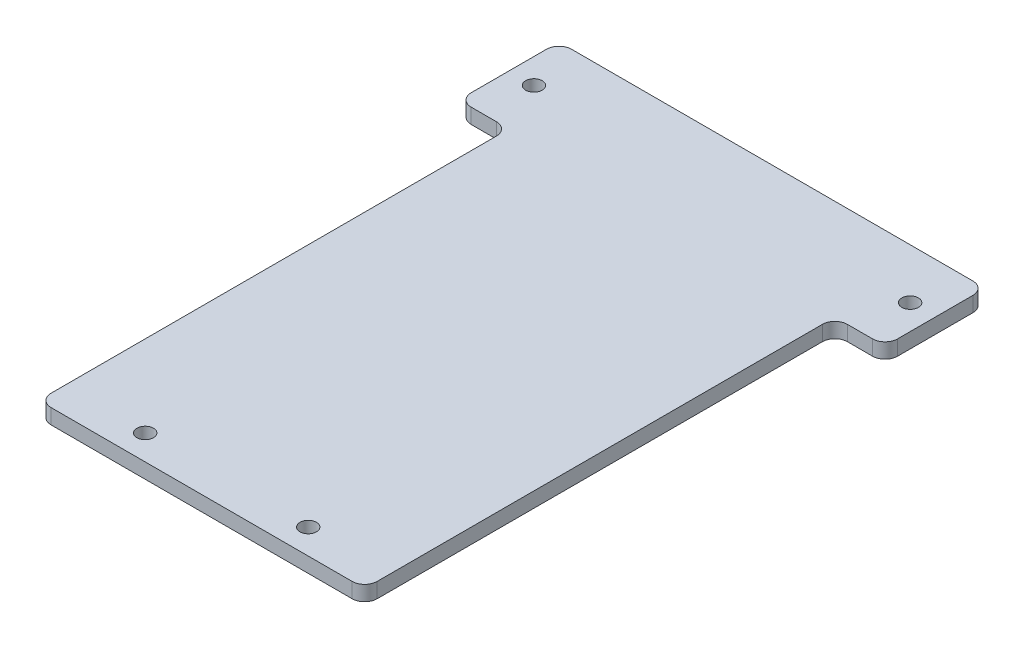
ISO-10303-21;
HEADER;
FILE_DESCRIPTION(('STEP AP214'),'2;1');
FILE_NAME('part.step','',(''),(''),'','','');
FILE_SCHEMA(('AUTOMOTIVE_DESIGN { 1 0 10303 214 1 1 1 1 }'));
ENDSEC;
DATA;
#1=APPLICATION_CONTEXT('core data for automotive mechanical design processes');
#2=APPLICATION_PROTOCOL_DEFINITION('international standard','automotive_design',2000,#1);
#3=PRODUCT_CONTEXT('',#1,'mechanical');
#4=PRODUCT('Part','Part','',(#3));
#5=PRODUCT_RELATED_PRODUCT_CATEGORY('part','',(#4));
#6=PRODUCT_DEFINITION_FORMATION('','',#4);
#7=PRODUCT_DEFINITION_CONTEXT('part definition',#1,'design');
#8=PRODUCT_DEFINITION('design','',#6,#7);
#9=PRODUCT_DEFINITION_SHAPE('','',#8);
#10=(LENGTH_UNIT() NAMED_UNIT(*) SI_UNIT(.MILLI.,.METRE.));
#11=(NAMED_UNIT(*) PLANE_ANGLE_UNIT() SI_UNIT($,.RADIAN.));
#12=(NAMED_UNIT(*) SI_UNIT($,.STERADIAN.) SOLID_ANGLE_UNIT());
#13=UNCERTAINTY_MEASURE_WITH_UNIT(LENGTH_MEASURE(1.E-05),#10,'distance_accuracy_value','');
#14=(GEOMETRIC_REPRESENTATION_CONTEXT(3) GLOBAL_UNCERTAINTY_ASSIGNED_CONTEXT((#13)) GLOBAL_UNIT_ASSIGNED_CONTEXT((#10,
#11,#12)) REPRESENTATION_CONTEXT('',''));
#15=CARTESIAN_POINT('',(0.,0.,0.));
#16=DIRECTION('',(0.,0.,1.));
#17=DIRECTION('',(1.,0.,0.));
#18=AXIS2_PLACEMENT_3D('',#15,#16,#17);
#19=CARTESIAN_POINT('',(65.,6.,-93.75));
#20=DIRECTION('',(0.,0.,-1.));
#21=DIRECTION('',(-1.,0.,0.));
#22=AXIS2_PLACEMENT_3D('',#19,#20,#21);
#23=PLANE('',#22);
#24=DIRECTION('',(1.,0.,0.));
#25=VECTOR('',#24,1.);
#26=CARTESIAN_POINT('',(65.,0.,-93.75));
#27=LINE('',#26,#25);
#28=CARTESIAN_POINT('',(70.,0.,-93.75));
#29=VERTEX_POINT('',#28);
#30=CARTESIAN_POINT('',(80.,0.,-93.75));
#31=VERTEX_POINT('',#30);
#32=EDGE_CURVE('E251',#29,#31,#27,.T.);
#33=ORIENTED_EDGE('',*,*,#32,.T.);
#34=DIRECTION('',(0.,-1.,0.));
#35=VECTOR('',#34,1.);
#36=CARTESIAN_POINT('',(80.,6.,-93.75));
#37=LINE('',#36,#35);
#38=CARTESIAN_POINT('',(80.,6.,-93.75));
#39=VERTEX_POINT('',#38);
#40=EDGE_CURVE('E238',#31,#39,#37,.F.);
#41=ORIENTED_EDGE('',*,*,#40,.T.);
#42=DIRECTION('',(1.,0.,0.));
#43=VECTOR('',#42,1.);
#44=CARTESIAN_POINT('',(65.,6.,-93.75));
#45=LINE('',#44,#43);
#46=CARTESIAN_POINT('',(70.,6.,-93.75));
#47=VERTEX_POINT('',#46);
#48=EDGE_CURVE('E192',#47,#39,#45,.T.);
#49=ORIENTED_EDGE('',*,*,#48,.F.);
#50=DIRECTION('',(0.,-1.,0.));
#51=VECTOR('',#50,1.);
#52=CARTESIAN_POINT('',(70.,0.,-93.75));
#53=LINE('',#52,#51);
#54=EDGE_CURVE('E235',#47,#29,#53,.T.);
#55=ORIENTED_EDGE('',*,*,#54,.T.);
#56=EDGE_LOOP('',(#33,#41,#49,#55));
#57=FACE_BOUND('',#56,.T.);
#58=ADVANCED_FACE('F39',(#57),#23,.F.);
#59=CARTESIAN_POINT('',(85.,6.,-133.75));
#60=DIRECTION('',(-1.,0.,0.));
#61=DIRECTION('',(0.,0.,1.));
#62=AXIS2_PLACEMENT_3D('',#59,#60,#61);
#63=PLANE('',#62);
#64=DIRECTION('',(0.,0.,-1.));
#65=VECTOR('',#64,1.);
#66=CARTESIAN_POINT('',(85.,0.,-133.75));
#67=LINE('',#66,#65);
#68=CARTESIAN_POINT('',(85.,0.,-98.75));
#69=VERTEX_POINT('',#68);
#70=CARTESIAN_POINT('',(85.,0.,-128.75));
#71=VERTEX_POINT('',#70);
#72=EDGE_CURVE('E286',#69,#71,#67,.T.);
#73=ORIENTED_EDGE('',*,*,#72,.T.);
#74=DIRECTION('',(0.,-1.,0.));
#75=VECTOR('',#74,1.);
#76=CARTESIAN_POINT('',(85.,6.,-128.75));
#77=LINE('',#76,#75);
#78=CARTESIAN_POINT('',(85.,6.,-128.75));
#79=VERTEX_POINT('',#78);
#80=EDGE_CURVE('E233',#71,#79,#77,.F.);
#81=ORIENTED_EDGE('',*,*,#80,.T.);
#82=DIRECTION('',(0.,0.,-1.));
#83=VECTOR('',#82,1.);
#84=CARTESIAN_POINT('',(85.,6.,-133.75));
#85=LINE('',#84,#83);
#86=CARTESIAN_POINT('',(85.,6.,-98.75));
#87=VERTEX_POINT('',#86);
#88=EDGE_CURVE('E265',#87,#79,#85,.T.);
#89=ORIENTED_EDGE('',*,*,#88,.F.);
#90=DIRECTION('',(0.,-1.,0.));
#91=VECTOR('',#90,1.);
#92=CARTESIAN_POINT('',(85.,6.,-98.75));
#93=LINE('',#92,#91);
#94=EDGE_CURVE('E230',#87,#69,#93,.T.);
#95=ORIENTED_EDGE('',*,*,#94,.T.);
#96=EDGE_LOOP('',(#73,#81,#89,#95));
#97=FACE_BOUND('',#96,.T.);
#98=ADVANCED_FACE('F316',(#97),#63,.F.);
#99=CARTESIAN_POINT('',(-85.,6.,-133.75));
#100=DIRECTION('',(0.,0.,1.));
#101=DIRECTION('',(1.,0.,0.));
#102=AXIS2_PLACEMENT_3D('',#99,#100,#101);
#103=PLANE('',#102);
#104=DIRECTION('',(-1.,0.,0.));
#105=VECTOR('',#104,1.);
#106=CARTESIAN_POINT('',(-85.,0.,-133.75));
#107=LINE('',#106,#105);
#108=CARTESIAN_POINT('',(80.,0.,-133.75));
#109=VERTEX_POINT('',#108);
#110=CARTESIAN_POINT('',(-80.,0.,-133.75));
#111=VERTEX_POINT('',#110);
#112=EDGE_CURVE('E290',#109,#111,#107,.T.);
#113=ORIENTED_EDGE('',*,*,#112,.T.);
#114=DIRECTION('',(0.,-1.,0.));
#115=VECTOR('',#114,1.);
#116=CARTESIAN_POINT('',(-80.,6.,-133.75));
#117=LINE('',#116,#115);
#118=CARTESIAN_POINT('',(-80.,6.,-133.75));
#119=VERTEX_POINT('',#118);
#120=EDGE_CURVE('E217',#111,#119,#117,.F.);
#121=ORIENTED_EDGE('',*,*,#120,.T.);
#122=DIRECTION('',(-1.,0.,0.));
#123=VECTOR('',#122,1.);
#124=CARTESIAN_POINT('',(-85.,6.,-133.75));
#125=LINE('',#124,#123);
#126=CARTESIAN_POINT('',(80.,6.,-133.75));
#127=VERTEX_POINT('',#126);
#128=EDGE_CURVE('E268',#127,#119,#125,.T.);
#129=ORIENTED_EDGE('',*,*,#128,.F.);
#130=DIRECTION('',(0.,-1.,0.));
#131=VECTOR('',#130,1.);
#132=CARTESIAN_POINT('',(80.,6.,-133.75));
#133=LINE('',#132,#131);
#134=EDGE_CURVE('E214',#127,#109,#133,.T.);
#135=ORIENTED_EDGE('',*,*,#134,.T.);
#136=EDGE_LOOP('',(#113,#121,#129,#135));
#137=FACE_BOUND('',#136,.T.);
#138=ADVANCED_FACE('F313',(#137),#103,.F.);
#139=CARTESIAN_POINT('',(-85.,6.,-133.75));
#140=DIRECTION('',(1.,0.,0.));
#141=DIRECTION('',(0.,0.,-1.));
#142=AXIS2_PLACEMENT_3D('',#139,#140,#141);
#143=PLANE('',#142);
#144=DIRECTION('',(0.,0.,1.));
#145=VECTOR('',#144,1.);
#146=CARTESIAN_POINT('',(-85.,6.,-133.75));
#147=LINE('',#146,#145);
#148=CARTESIAN_POINT('',(-85.,6.,-128.75));
#149=VERTEX_POINT('',#148);
#150=CARTESIAN_POINT('',(-85.,6.,-98.75));
#151=VERTEX_POINT('',#150);
#152=EDGE_CURVE('E275',#149,#151,#147,.T.);
#153=ORIENTED_EDGE('',*,*,#152,.F.);
#154=DIRECTION('',(0.,-1.,0.));
#155=VECTOR('',#154,1.);
#156=CARTESIAN_POINT('',(-85.,6.,-128.75));
#157=LINE('',#156,#155);
#158=CARTESIAN_POINT('',(-85.,0.,-128.75));
#159=VERTEX_POINT('',#158);
#160=EDGE_CURVE('E200',#149,#159,#157,.T.);
#161=ORIENTED_EDGE('',*,*,#160,.T.);
#162=DIRECTION('',(0.,0.,1.));
#163=VECTOR('',#162,1.);
#164=CARTESIAN_POINT('',(-85.,0.,-133.75));
#165=LINE('',#164,#163);
#166=CARTESIAN_POINT('',(-85.,0.,-98.75));
#167=VERTEX_POINT('',#166);
#168=EDGE_CURVE('E187',#159,#167,#165,.T.);
#169=ORIENTED_EDGE('',*,*,#168,.T.);
#170=DIRECTION('',(0.,-1.,0.));
#171=VECTOR('',#170,1.);
#172=CARTESIAN_POINT('',(-85.,6.,-98.75));
#173=LINE('',#172,#171);
#174=EDGE_CURVE('E198',#167,#151,#173,.F.);
#175=ORIENTED_EDGE('',*,*,#174,.T.);
#176=EDGE_LOOP('',(#153,#161,#169,#175));
#177=FACE_BOUND('',#176,.T.);
#178=ADVANCED_FACE('F296',(#177),#143,.F.);
#179=CARTESIAN_POINT('',(-85.,6.,-93.75));
#180=DIRECTION('',(0.,0.,-1.));
#181=DIRECTION('',(-1.,0.,0.));
#182=AXIS2_PLACEMENT_3D('',#179,#180,#181);
#183=PLANE('',#182);
#184=DIRECTION('',(1.,0.,0.));
#185=VECTOR('',#184,1.);
#186=CARTESIAN_POINT('',(-85.,0.,-93.75));
#187=LINE('',#186,#185);
#188=CARTESIAN_POINT('',(-80.,0.,-93.75));
#189=VERTEX_POINT('',#188);
#190=CARTESIAN_POINT('',(-70.,0.,-93.75));
#191=VERTEX_POINT('',#190);
#192=EDGE_CURVE('E182',#189,#191,#187,.T.);
#193=ORIENTED_EDGE('',*,*,#192,.T.);
#194=DIRECTION('',(0.,-1.,0.));
#195=VECTOR('',#194,1.);
#196=CARTESIAN_POINT('',(-70.,6.,-93.75));
#197=LINE('',#196,#195);
#198=CARTESIAN_POINT('',(-70.,6.,-93.75));
#199=VERTEX_POINT('',#198);
#200=EDGE_CURVE('E158',#191,#199,#197,.F.);
#201=ORIENTED_EDGE('',*,*,#200,.T.);
#202=DIRECTION('',(1.,0.,0.));
#203=VECTOR('',#202,1.);
#204=CARTESIAN_POINT('',(-85.,6.,-93.75));
#205=LINE('',#204,#203);
#206=CARTESIAN_POINT('',(-80.,6.,-93.75));
#207=VERTEX_POINT('',#206);
#208=EDGE_CURVE('E278',#207,#199,#205,.T.);
#209=ORIENTED_EDGE('',*,*,#208,.F.);
#210=DIRECTION('',(0.,-1.,0.));
#211=VECTOR('',#210,1.);
#212=CARTESIAN_POINT('',(-80.,6.,-93.75));
#213=LINE('',#212,#211);
#214=EDGE_CURVE('E174',#207,#189,#213,.T.);
#215=ORIENTED_EDGE('',*,*,#214,.T.);
#216=EDGE_LOOP('',(#193,#201,#209,#215));
#217=FACE_BOUND('',#216,.T.);
#218=ADVANCED_FACE('F304',(#217),#183,.F.);
#219=CARTESIAN_POINT('',(-65.,6.,93.75));
#220=DIRECTION('',(1.,0.,0.));
#221=DIRECTION('',(0.,0.,-1.));
#222=AXIS2_PLACEMENT_3D('',#219,#220,#221);
#223=PLANE('',#222);
#224=DIRECTION('',(0.,0.,1.));
#225=VECTOR('',#224,1.);
#226=CARTESIAN_POINT('',(-65.,6.,93.75));
#227=LINE('',#226,#225);
#228=CARTESIAN_POINT('',(-65.,6.,-88.75));
#229=VERTEX_POINT('',#228);
#230=CARTESIAN_POINT('',(-65.,6.,88.75));
#231=VERTEX_POINT('',#230);
#232=EDGE_CURVE('E173',#229,#231,#227,.T.);
#233=ORIENTED_EDGE('',*,*,#232,.F.);
#234=DIRECTION('',(0.,-1.,0.));
#235=VECTOR('',#234,1.);
#236=CARTESIAN_POINT('',(-65.,0.,-88.75));
#237=LINE('',#236,#235);
#238=CARTESIAN_POINT('',(-65.,0.,-88.75));
#239=VERTEX_POINT('',#238);
#240=EDGE_CURVE('E157',#229,#239,#237,.T.);
#241=ORIENTED_EDGE('',*,*,#240,.T.);
#242=DIRECTION('',(0.,0.,1.));
#243=VECTOR('',#242,1.);
#244=CARTESIAN_POINT('',(-65.,0.,93.75));
#245=LINE('',#244,#243);
#246=CARTESIAN_POINT('',(-65.,0.,88.75));
#247=VERTEX_POINT('',#246);
#248=EDGE_CURVE('E170',#239,#247,#245,.T.);
#249=ORIENTED_EDGE('',*,*,#248,.T.);
#250=DIRECTION('',(0.,-1.,0.));
#251=VECTOR('',#250,1.);
#252=CARTESIAN_POINT('',(-65.,6.,88.75));
#253=LINE('',#252,#251);
#254=EDGE_CURVE('E175',#247,#231,#253,.F.);
#255=ORIENTED_EDGE('',*,*,#254,.T.);
#256=EDGE_LOOP('',(#233,#241,#249,#255));
#257=FACE_BOUND('',#256,.T.);
#258=ADVANCED_FACE('F169',(#257),#223,.F.);
#259=CARTESIAN_POINT('',(-65.,6.,93.75));
#260=DIRECTION('',(0.,0.,-1.));
#261=DIRECTION('',(-1.,0.,0.));
#262=AXIS2_PLACEMENT_3D('',#259,#260,#261);
#263=PLANE('',#262);
#264=DIRECTION('',(1.,0.,0.));
#265=VECTOR('',#264,1.);
#266=CARTESIAN_POINT('',(-65.,0.,93.75));
#267=LINE('',#266,#265);
#268=CARTESIAN_POINT('',(-60.,0.,93.75));
#269=VERTEX_POINT('',#268);
#270=CARTESIAN_POINT('',(60.,0.,93.75));
#271=VERTEX_POINT('',#270);
#272=EDGE_CURVE('E181',#269,#271,#267,.T.);
#273=ORIENTED_EDGE('',*,*,#272,.T.);
#274=DIRECTION('',(0.,-1.,0.));
#275=VECTOR('',#274,1.);
#276=CARTESIAN_POINT('',(60.,6.,93.75));
#277=LINE('',#276,#275);
#278=CARTESIAN_POINT('',(60.,6.,93.75));
#279=VERTEX_POINT('',#278);
#280=EDGE_CURVE('E164',#271,#279,#277,.F.);
#281=ORIENTED_EDGE('',*,*,#280,.T.);
#282=DIRECTION('',(1.,0.,0.));
#283=VECTOR('',#282,1.);
#284=CARTESIAN_POINT('',(-65.,6.,93.75));
#285=LINE('',#284,#283);
#286=CARTESIAN_POINT('',(-60.,6.,93.75));
#287=VERTEX_POINT('',#286);
#288=EDGE_CURVE('E282',#287,#279,#285,.T.);
#289=ORIENTED_EDGE('',*,*,#288,.F.);
#290=DIRECTION('',(0.,-1.,0.));
#291=VECTOR('',#290,1.);
#292=CARTESIAN_POINT('',(-60.,6.,93.75));
#293=LINE('',#292,#291);
#294=EDGE_CURVE('E244',#287,#269,#293,.T.);
#295=ORIENTED_EDGE('',*,*,#294,.T.);
#296=EDGE_LOOP('',(#273,#281,#289,#295));
#297=FACE_BOUND('',#296,.T.);
#298=ADVANCED_FACE('F311',(#297),#263,.F.);
#299=CARTESIAN_POINT('',(65.,6.,93.75));
#300=DIRECTION('',(-1.,0.,0.));
#301=DIRECTION('',(0.,0.,1.));
#302=AXIS2_PLACEMENT_3D('',#299,#300,#301);
#303=PLANE('',#302);
#304=DIRECTION('',(0.,0.,-1.));
#305=VECTOR('',#304,1.);
#306=CARTESIAN_POINT('',(65.,0.,93.75));
#307=LINE('',#306,#305);
#308=CARTESIAN_POINT('',(65.,0.,88.75));
#309=VERTEX_POINT('',#308);
#310=CARTESIAN_POINT('',(65.,0.,-88.75));
#311=VERTEX_POINT('',#310);
#312=EDGE_CURVE('E185',#309,#311,#307,.T.);
#313=ORIENTED_EDGE('',*,*,#312,.T.);
#314=DIRECTION('',(0.,-1.,0.));
#315=VECTOR('',#314,1.);
#316=CARTESIAN_POINT('',(65.,6.,-88.75));
#317=LINE('',#316,#315);
#318=CARTESIAN_POINT('',(65.,6.,-88.75));
#319=VERTEX_POINT('',#318);
#320=EDGE_CURVE('E54',#311,#319,#317,.F.);
#321=ORIENTED_EDGE('',*,*,#320,.T.);
#322=DIRECTION('',(0.,0.,-1.));
#323=VECTOR('',#322,1.);
#324=CARTESIAN_POINT('',(65.,6.,93.75));
#325=LINE('',#324,#323);
#326=CARTESIAN_POINT('',(65.,6.,88.75));
#327=VERTEX_POINT('',#326);
#328=EDGE_CURVE('E193',#327,#319,#325,.T.);
#329=ORIENTED_EDGE('',*,*,#328,.F.);
#330=DIRECTION('',(0.,-1.,0.));
#331=VECTOR('',#330,1.);
#332=CARTESIAN_POINT('',(65.,6.,88.75));
#333=LINE('',#332,#331);
#334=EDGE_CURVE('E240',#327,#309,#333,.T.);
#335=ORIENTED_EDGE('',*,*,#334,.T.);
#336=EDGE_LOOP('',(#313,#321,#329,#335));
#337=FACE_BOUND('',#336,.T.);
#338=ADVANCED_FACE('F254',(#337),#303,.F.);
#339=CARTESIAN_POINT('',(0.,6.,0.));
#340=DIRECTION('',(0.,-1.,0.));
#341=DIRECTION('',(0.,0.,-1.));
#342=AXIS2_PLACEMENT_3D('',#339,#340,#341);
#343=PLANE('',#342);
#344=CARTESIAN_POINT('',(-75.,6.,-113.75));
#345=DIRECTION('',(0.,1.,0.));
#346=DIRECTION('',(0.,0.,1.));
#347=AXIS2_PLACEMENT_3D('',#344,#345,#346);
#348=CIRCLE('',#347,3.3);
#349=CARTESIAN_POINT('',(-75.,6.,-110.45));
#350=VERTEX_POINT('',#349);
#351=EDGE_CURVE('E389',#350,#350,#348,.T.);
#352=ORIENTED_EDGE('',*,*,#351,.F.);
#353=EDGE_LOOP('',(#352));
#354=FACE_BOUND('',#353,.T.);
#355=CARTESIAN_POINT('',(32.5,6.,83.75));
#356=DIRECTION('',(0.,1.,0.));
#357=DIRECTION('',(0.,0.,-1.));
#358=AXIS2_PLACEMENT_3D('',#355,#356,#357);
#359=CIRCLE('',#358,3.3);
#360=CARTESIAN_POINT('',(32.5,6.,80.45));
#361=VERTEX_POINT('',#360);
#362=EDGE_CURVE('E397',#361,#361,#359,.T.);
#363=ORIENTED_EDGE('',*,*,#362,.F.);
#364=EDGE_LOOP('',(#363));
#365=FACE_BOUND('',#364,.T.);
#366=CARTESIAN_POINT('',(75.,6.,-113.75));
#367=DIRECTION('',(0.,1.,0.));
#368=DIRECTION('',(0.,0.,-1.));
#369=AXIS2_PLACEMENT_3D('',#366,#367,#368);
#370=CIRCLE('',#369,3.3);
#371=CARTESIAN_POINT('',(75.,6.,-117.05));
#372=VERTEX_POINT('',#371);
#373=EDGE_CURVE('E404',#372,#372,#370,.T.);
#374=ORIENTED_EDGE('',*,*,#373,.F.);
#375=EDGE_LOOP('',(#374));
#376=FACE_BOUND('',#375,.T.);
#377=CARTESIAN_POINT('',(-32.5,6.,83.75));
#378=DIRECTION('',(0.,1.,0.));
#379=DIRECTION('',(0.,0.,1.));
#380=AXIS2_PLACEMENT_3D('',#377,#378,#379);
#381=CIRCLE('',#380,3.3);
#382=CARTESIAN_POINT('',(-32.5,6.,87.05));
#383=VERTEX_POINT('',#382);
#384=EDGE_CURVE('E390',#383,#383,#381,.T.);
#385=ORIENTED_EDGE('',*,*,#384,.F.);
#386=EDGE_LOOP('',(#385));
#387=FACE_BOUND('',#386,.T.);
#388=ORIENTED_EDGE('',*,*,#128,.T.);
#389=CARTESIAN_POINT('',(-80.,6.,-128.75));
#390=DIRECTION('',(0.,-1.,0.));
#391=DIRECTION('',(0.,0.,-1.));
#392=AXIS2_PLACEMENT_3D('',#389,#390,#391);
#393=CIRCLE('',#392,5.);
#394=EDGE_CURVE('E228',#119,#149,#393,.F.);
#395=ORIENTED_EDGE('',*,*,#394,.T.);
#396=ORIENTED_EDGE('',*,*,#152,.T.);
#397=CARTESIAN_POINT('',(-80.,6.,-98.75));
#398=DIRECTION('',(0.,-1.,0.));
#399=DIRECTION('',(0.,0.,-1.));
#400=AXIS2_PLACEMENT_3D('',#397,#398,#399);
#401=CIRCLE('',#400,5.);
#402=EDGE_CURVE('E226',#151,#207,#401,.F.);
#403=ORIENTED_EDGE('',*,*,#402,.T.);
#404=ORIENTED_EDGE('',*,*,#208,.T.);
#405=CARTESIAN_POINT('',(-70.,6.,-88.75));
#406=DIRECTION('',(0.,-1.,0.));
#407=DIRECTION('',(0.,0.,-1.));
#408=AXIS2_PLACEMENT_3D('',#405,#406,#407);
#409=CIRCLE('',#408,5.);
#410=EDGE_CURVE('E163',#199,#229,#409,.T.);
#411=ORIENTED_EDGE('',*,*,#410,.T.);
#412=ORIENTED_EDGE('',*,*,#232,.T.);
#413=CARTESIAN_POINT('',(-60.,6.,88.75));
#414=DIRECTION('',(0.,-1.,0.));
#415=DIRECTION('',(0.,0.,-1.));
#416=AXIS2_PLACEMENT_3D('',#413,#414,#415);
#417=CIRCLE('',#416,5.);
#418=EDGE_CURVE('E219',#231,#287,#417,.F.);
#419=ORIENTED_EDGE('',*,*,#418,.T.);
#420=ORIENTED_EDGE('',*,*,#288,.T.);
#421=CARTESIAN_POINT('',(60.,6.,88.75));
#422=DIRECTION('',(0.,-1.,0.));
#423=DIRECTION('',(0.,0.,-1.));
#424=AXIS2_PLACEMENT_3D('',#421,#422,#423);
#425=CIRCLE('',#424,5.);
#426=EDGE_CURVE('E61',#279,#327,#425,.F.);
#427=ORIENTED_EDGE('',*,*,#426,.T.);
#428=ORIENTED_EDGE('',*,*,#328,.T.);
#429=CARTESIAN_POINT('',(70.,6.,-88.75));
#430=DIRECTION('',(0.,-1.,0.));
#431=DIRECTION('',(0.,0.,-1.));
#432=AXIS2_PLACEMENT_3D('',#429,#430,#431);
#433=CIRCLE('',#432,5.);
#434=EDGE_CURVE('E11',#319,#47,#433,.T.);
#435=ORIENTED_EDGE('',*,*,#434,.T.);
#436=ORIENTED_EDGE('',*,*,#48,.T.);
#437=CARTESIAN_POINT('',(80.,6.,-98.75));
#438=DIRECTION('',(0.,-1.,0.));
#439=DIRECTION('',(0.,0.,-1.));
#440=AXIS2_PLACEMENT_3D('',#437,#438,#439);
#441=CIRCLE('',#440,5.);
#442=EDGE_CURVE('E222',#39,#87,#441,.F.);
#443=ORIENTED_EDGE('',*,*,#442,.T.);
#444=ORIENTED_EDGE('',*,*,#88,.T.);
#445=CARTESIAN_POINT('',(80.,6.,-128.75));
#446=DIRECTION('',(0.,-1.,0.));
#447=DIRECTION('',(0.,0.,-1.));
#448=AXIS2_PLACEMENT_3D('',#445,#446,#447);
#449=CIRCLE('',#448,5.);
#450=EDGE_CURVE('E224',#79,#127,#449,.F.);
#451=ORIENTED_EDGE('',*,*,#450,.T.);
#452=EDGE_LOOP('',(#388,#395,#396,#403,#404,#411,#412,#419,#420,#427,#428,#435,#436,#443,#444,#451));
#453=FACE_BOUND('',#452,.T.);
#454=ADVANCED_FACE('F261',(#354,#365,#376,#387,#453),#343,.F.);
#455=CARTESIAN_POINT('',(0.,0.,0.));
#456=DIRECTION('',(0.,-1.,0.));
#457=DIRECTION('',(0.,0.,-1.));
#458=AXIS2_PLACEMENT_3D('',#455,#456,#457);
#459=PLANE('',#458);
#460=CARTESIAN_POINT('',(-75.,0.,-113.75));
#461=DIRECTION('',(0.,1.,0.));
#462=DIRECTION('',(0.,0.,1.));
#463=AXIS2_PLACEMENT_3D('',#460,#461,#462);
#464=CIRCLE('',#463,3.3);
#465=CARTESIAN_POINT('',(-75.,0.,-110.45));
#466=VERTEX_POINT('',#465);
#467=EDGE_CURVE('E287',#466,#466,#464,.T.);
#468=ORIENTED_EDGE('',*,*,#467,.T.);
#469=EDGE_LOOP('',(#468));
#470=FACE_BOUND('',#469,.T.);
#471=CARTESIAN_POINT('',(32.5,0.,83.75));
#472=DIRECTION('',(0.,1.,0.));
#473=DIRECTION('',(0.,0.,-1.));
#474=AXIS2_PLACEMENT_3D('',#471,#472,#473);
#475=CIRCLE('',#474,3.3);
#476=CARTESIAN_POINT('',(32.5,0.,80.45));
#477=VERTEX_POINT('',#476);
#478=EDGE_CURVE('E400',#477,#477,#475,.T.);
#479=ORIENTED_EDGE('',*,*,#478,.T.);
#480=EDGE_LOOP('',(#479));
#481=FACE_BOUND('',#480,.T.);
#482=CARTESIAN_POINT('',(75.,0.,-113.75));
#483=DIRECTION('',(0.,1.,0.));
#484=DIRECTION('',(0.,0.,-1.));
#485=AXIS2_PLACEMENT_3D('',#482,#483,#484);
#486=CIRCLE('',#485,3.3);
#487=CARTESIAN_POINT('',(75.,0.,-117.05));
#488=VERTEX_POINT('',#487);
#489=EDGE_CURVE('E271',#488,#488,#486,.T.);
#490=ORIENTED_EDGE('',*,*,#489,.T.);
#491=EDGE_LOOP('',(#490));
#492=FACE_BOUND('',#491,.T.);
#493=CARTESIAN_POINT('',(-32.5,0.,83.75));
#494=DIRECTION('',(0.,1.,0.));
#495=DIRECTION('',(0.,0.,1.));
#496=AXIS2_PLACEMENT_3D('',#493,#494,#495);
#497=CIRCLE('',#496,3.3);
#498=CARTESIAN_POINT('',(-32.5,0.,87.05));
#499=VERTEX_POINT('',#498);
#500=EDGE_CURVE('E394',#499,#499,#497,.T.);
#501=ORIENTED_EDGE('',*,*,#500,.T.);
#502=EDGE_LOOP('',(#501));
#503=FACE_BOUND('',#502,.T.);
#504=ORIENTED_EDGE('',*,*,#168,.F.);
#505=CARTESIAN_POINT('',(-80.,0.,-128.75));
#506=DIRECTION('',(0.,-1.,0.));
#507=DIRECTION('',(0.,0.,-1.));
#508=AXIS2_PLACEMENT_3D('',#505,#506,#507);
#509=CIRCLE('',#508,5.);
#510=EDGE_CURVE('E212',#159,#111,#509,.T.);
#511=ORIENTED_EDGE('',*,*,#510,.T.);
#512=ORIENTED_EDGE('',*,*,#112,.F.);
#513=CARTESIAN_POINT('',(80.,0.,-128.75));
#514=DIRECTION('',(0.,-1.,0.));
#515=DIRECTION('',(0.,0.,-1.));
#516=AXIS2_PLACEMENT_3D('',#513,#514,#515);
#517=CIRCLE('',#516,5.);
#518=EDGE_CURVE('E208',#109,#71,#517,.T.);
#519=ORIENTED_EDGE('',*,*,#518,.T.);
#520=ORIENTED_EDGE('',*,*,#72,.F.);
#521=CARTESIAN_POINT('',(80.,0.,-98.75));
#522=DIRECTION('',(0.,-1.,0.));
#523=DIRECTION('',(0.,0.,-1.));
#524=AXIS2_PLACEMENT_3D('',#521,#522,#523);
#525=CIRCLE('',#524,5.);
#526=EDGE_CURVE('E206',#69,#31,#525,.T.);
#527=ORIENTED_EDGE('',*,*,#526,.T.);
#528=ORIENTED_EDGE('',*,*,#32,.F.);
#529=CARTESIAN_POINT('',(70.,0.,-88.75));
#530=DIRECTION('',(0.,-1.,0.));
#531=DIRECTION('',(0.,0.,-1.));
#532=AXIS2_PLACEMENT_3D('',#529,#530,#531);
#533=CIRCLE('',#532,5.);
#534=EDGE_CURVE('E47',#29,#311,#533,.F.);
#535=ORIENTED_EDGE('',*,*,#534,.T.);
#536=ORIENTED_EDGE('',*,*,#312,.F.);
#537=CARTESIAN_POINT('',(60.,0.,88.75));
#538=DIRECTION('',(0.,-1.,0.));
#539=DIRECTION('',(0.,0.,-1.));
#540=AXIS2_PLACEMENT_3D('',#537,#538,#539);
#541=CIRCLE('',#540,5.);
#542=EDGE_CURVE('E204',#309,#271,#541,.T.);
#543=ORIENTED_EDGE('',*,*,#542,.T.);
#544=ORIENTED_EDGE('',*,*,#272,.F.);
#545=CARTESIAN_POINT('',(-60.,0.,88.75));
#546=DIRECTION('',(0.,-1.,0.));
#547=DIRECTION('',(0.,0.,-1.));
#548=AXIS2_PLACEMENT_3D('',#545,#546,#547);
#549=CIRCLE('',#548,5.);
#550=EDGE_CURVE('E180',#269,#247,#549,.T.);
#551=ORIENTED_EDGE('',*,*,#550,.T.);
#552=ORIENTED_EDGE('',*,*,#248,.F.);
#553=CARTESIAN_POINT('',(-70.,0.,-88.75));
#554=DIRECTION('',(0.,-1.,0.));
#555=DIRECTION('',(0.,0.,-1.));
#556=AXIS2_PLACEMENT_3D('',#553,#554,#555);
#557=CIRCLE('',#556,5.);
#558=EDGE_CURVE('E153',#239,#191,#557,.F.);
#559=ORIENTED_EDGE('',*,*,#558,.T.);
#560=ORIENTED_EDGE('',*,*,#192,.F.);
#561=CARTESIAN_POINT('',(-80.,0.,-98.75));
#562=DIRECTION('',(0.,-1.,0.));
#563=DIRECTION('',(0.,0.,-1.));
#564=AXIS2_PLACEMENT_3D('',#561,#562,#563);
#565=CIRCLE('',#564,5.);
#566=EDGE_CURVE('E210',#189,#167,#565,.T.);
#567=ORIENTED_EDGE('',*,*,#566,.T.);
#568=EDGE_LOOP('',(#504,#511,#512,#519,#520,#527,#528,#535,#536,#543,#544,#551,#552,#559,#560,#567));
#569=FACE_BOUND('',#568,.T.);
#570=ADVANCED_FACE('F178',(#470,#481,#492,#503,#569),#459,.T.);
#571=CARTESIAN_POINT('',(-32.5,0.,83.75));
#572=DIRECTION('',(0.,1.,0.));
#573=DIRECTION('',(0.,0.,1.));
#574=AXIS2_PLACEMENT_3D('',#571,#572,#573);
#575=CYLINDRICAL_SURFACE('',#574,3.3);
#576=ORIENTED_EDGE('',*,*,#500,.F.);
#577=EDGE_LOOP('',(#576));
#578=FACE_BOUND('',#577,.T.);
#579=ORIENTED_EDGE('',*,*,#384,.T.);
#580=EDGE_LOOP('',(#579));
#581=FACE_BOUND('',#580,.T.);
#582=ADVANCED_FACE('F364',(#578,#581),#575,.F.);
#583=CARTESIAN_POINT('',(75.,0.,-113.75));
#584=DIRECTION('',(0.,1.,0.));
#585=DIRECTION('',(0.,0.,1.));
#586=AXIS2_PLACEMENT_3D('',#583,#584,#585);
#587=CYLINDRICAL_SURFACE('',#586,3.3);
#588=ORIENTED_EDGE('',*,*,#489,.F.);
#589=EDGE_LOOP('',(#588));
#590=FACE_BOUND('',#589,.T.);
#591=ORIENTED_EDGE('',*,*,#373,.T.);
#592=EDGE_LOOP('',(#591));
#593=FACE_BOUND('',#592,.T.);
#594=ADVANCED_FACE('F369',(#590,#593),#587,.F.);
#595=CARTESIAN_POINT('',(32.5,0.,83.75));
#596=DIRECTION('',(0.,1.,0.));
#597=DIRECTION('',(0.,0.,1.));
#598=AXIS2_PLACEMENT_3D('',#595,#596,#597);
#599=CYLINDRICAL_SURFACE('',#598,3.3);
#600=ORIENTED_EDGE('',*,*,#478,.F.);
#601=EDGE_LOOP('',(#600));
#602=FACE_BOUND('',#601,.T.);
#603=ORIENTED_EDGE('',*,*,#362,.T.);
#604=EDGE_LOOP('',(#603));
#605=FACE_BOUND('',#604,.T.);
#606=ADVANCED_FACE('F372',(#602,#605),#599,.F.);
#607=CARTESIAN_POINT('',(-75.,0.,-113.75));
#608=DIRECTION('',(0.,1.,0.));
#609=DIRECTION('',(0.,0.,1.));
#610=AXIS2_PLACEMENT_3D('',#607,#608,#609);
#611=CYLINDRICAL_SURFACE('',#610,3.3);
#612=ORIENTED_EDGE('',*,*,#467,.F.);
#613=EDGE_LOOP('',(#612));
#614=FACE_BOUND('',#613,.T.);
#615=ORIENTED_EDGE('',*,*,#351,.T.);
#616=EDGE_LOOP('',(#615));
#617=FACE_BOUND('',#616,.T.);
#618=ADVANCED_FACE('F328',(#614,#617),#611,.F.);
#619=CARTESIAN_POINT('',(-70.,6.,-88.75));
#620=DIRECTION('',(0.,1.,0.));
#621=DIRECTION('',(0.,0.,1.));
#622=AXIS2_PLACEMENT_3D('',#619,#620,#621);
#623=CYLINDRICAL_SURFACE('',#622,5.);
#624=ORIENTED_EDGE('',*,*,#410,.F.);
#625=ORIENTED_EDGE('',*,*,#200,.F.);
#626=ORIENTED_EDGE('',*,*,#558,.F.);
#627=ORIENTED_EDGE('',*,*,#240,.F.);
#628=EDGE_LOOP('',(#624,#625,#626,#627));
#629=FACE_BOUND('',#628,.T.);
#630=ADVANCED_FACE('F156',(#629),#623,.F.);
#631=CARTESIAN_POINT('',(-80.,6.,-128.75));
#632=DIRECTION('',(0.,-1.,0.));
#633=DIRECTION('',(0.,0.,-1.));
#634=AXIS2_PLACEMENT_3D('',#631,#632,#633);
#635=CYLINDRICAL_SURFACE('',#634,5.);
#636=ORIENTED_EDGE('',*,*,#394,.F.);
#637=ORIENTED_EDGE('',*,*,#120,.F.);
#638=ORIENTED_EDGE('',*,*,#510,.F.);
#639=ORIENTED_EDGE('',*,*,#160,.F.);
#640=EDGE_LOOP('',(#636,#637,#638,#639));
#641=FACE_BOUND('',#640,.T.);
#642=ADVANCED_FACE('F327',(#641),#635,.T.);
#643=CARTESIAN_POINT('',(-80.,6.,-98.75));
#644=DIRECTION('',(0.,-1.,0.));
#645=DIRECTION('',(0.,0.,-1.));
#646=AXIS2_PLACEMENT_3D('',#643,#644,#645);
#647=CYLINDRICAL_SURFACE('',#646,5.);
#648=ORIENTED_EDGE('',*,*,#402,.F.);
#649=ORIENTED_EDGE('',*,*,#174,.F.);
#650=ORIENTED_EDGE('',*,*,#566,.F.);
#651=ORIENTED_EDGE('',*,*,#214,.F.);
#652=EDGE_LOOP('',(#648,#649,#650,#651));
#653=FACE_BOUND('',#652,.T.);
#654=ADVANCED_FACE('F300',(#653),#647,.T.);
#655=CARTESIAN_POINT('',(80.,6.,-128.75));
#656=DIRECTION('',(0.,-1.,0.));
#657=DIRECTION('',(0.,0.,-1.));
#658=AXIS2_PLACEMENT_3D('',#655,#656,#657);
#659=CYLINDRICAL_SURFACE('',#658,5.);
#660=ORIENTED_EDGE('',*,*,#450,.F.);
#661=ORIENTED_EDGE('',*,*,#80,.F.);
#662=ORIENTED_EDGE('',*,*,#518,.F.);
#663=ORIENTED_EDGE('',*,*,#134,.F.);
#664=EDGE_LOOP('',(#660,#661,#662,#663));
#665=FACE_BOUND('',#664,.T.);
#666=ADVANCED_FACE('F334',(#665),#659,.T.);
#667=CARTESIAN_POINT('',(80.,6.,-98.75));
#668=DIRECTION('',(0.,-1.,0.));
#669=DIRECTION('',(0.,0.,-1.));
#670=AXIS2_PLACEMENT_3D('',#667,#668,#669);
#671=CYLINDRICAL_SURFACE('',#670,5.);
#672=ORIENTED_EDGE('',*,*,#442,.F.);
#673=ORIENTED_EDGE('',*,*,#40,.F.);
#674=ORIENTED_EDGE('',*,*,#526,.F.);
#675=ORIENTED_EDGE('',*,*,#94,.F.);
#676=EDGE_LOOP('',(#672,#673,#674,#675));
#677=FACE_BOUND('',#676,.T.);
#678=ADVANCED_FACE('F337',(#677),#671,.T.);
#679=CARTESIAN_POINT('',(70.,6.,-88.75));
#680=DIRECTION('',(0.,1.,0.));
#681=DIRECTION('',(0.,0.,1.));
#682=AXIS2_PLACEMENT_3D('',#679,#680,#681);
#683=CYLINDRICAL_SURFACE('',#682,5.);
#684=ORIENTED_EDGE('',*,*,#434,.F.);
#685=ORIENTED_EDGE('',*,*,#320,.F.);
#686=ORIENTED_EDGE('',*,*,#534,.F.);
#687=ORIENTED_EDGE('',*,*,#54,.F.);
#688=EDGE_LOOP('',(#684,#685,#686,#687));
#689=FACE_BOUND('',#688,.T.);
#690=ADVANCED_FACE('F257',(#689),#683,.F.);
#691=CARTESIAN_POINT('',(60.,6.,88.75));
#692=DIRECTION('',(0.,-1.,0.));
#693=DIRECTION('',(0.,0.,-1.));
#694=AXIS2_PLACEMENT_3D('',#691,#692,#693);
#695=CYLINDRICAL_SURFACE('',#694,5.);
#696=ORIENTED_EDGE('',*,*,#426,.F.);
#697=ORIENTED_EDGE('',*,*,#280,.F.);
#698=ORIENTED_EDGE('',*,*,#542,.F.);
#699=ORIENTED_EDGE('',*,*,#334,.F.);
#700=EDGE_LOOP('',(#696,#697,#698,#699));
#701=FACE_BOUND('',#700,.T.);
#702=ADVANCED_FACE('F343',(#701),#695,.T.);
#703=CARTESIAN_POINT('',(-60.,6.,88.75));
#704=DIRECTION('',(0.,-1.,0.));
#705=DIRECTION('',(0.,0.,-1.));
#706=AXIS2_PLACEMENT_3D('',#703,#704,#705);
#707=CYLINDRICAL_SURFACE('',#706,5.);
#708=ORIENTED_EDGE('',*,*,#418,.F.);
#709=ORIENTED_EDGE('',*,*,#254,.F.);
#710=ORIENTED_EDGE('',*,*,#550,.F.);
#711=ORIENTED_EDGE('',*,*,#294,.F.);
#712=EDGE_LOOP('',(#708,#709,#710,#711));
#713=FACE_BOUND('',#712,.T.);
#714=ADVANCED_FACE('F41',(#713),#707,.T.);
#715=CLOSED_SHELL('',(#58,#98,#138,#178,#218,#258,#298,#338,#454,#570,#582,#594,#606,#618,#630,
#642,#654,#666,#678,#690,#702,#714));
#716=MANIFOLD_SOLID_BREP('B2',#715);
#717=ADVANCED_BREP_SHAPE_REPRESENTATION('',(#18,#716),#14);
#718=SHAPE_DEFINITION_REPRESENTATION(#9,#717);
ENDSEC;
END-ISO-10303-21;
